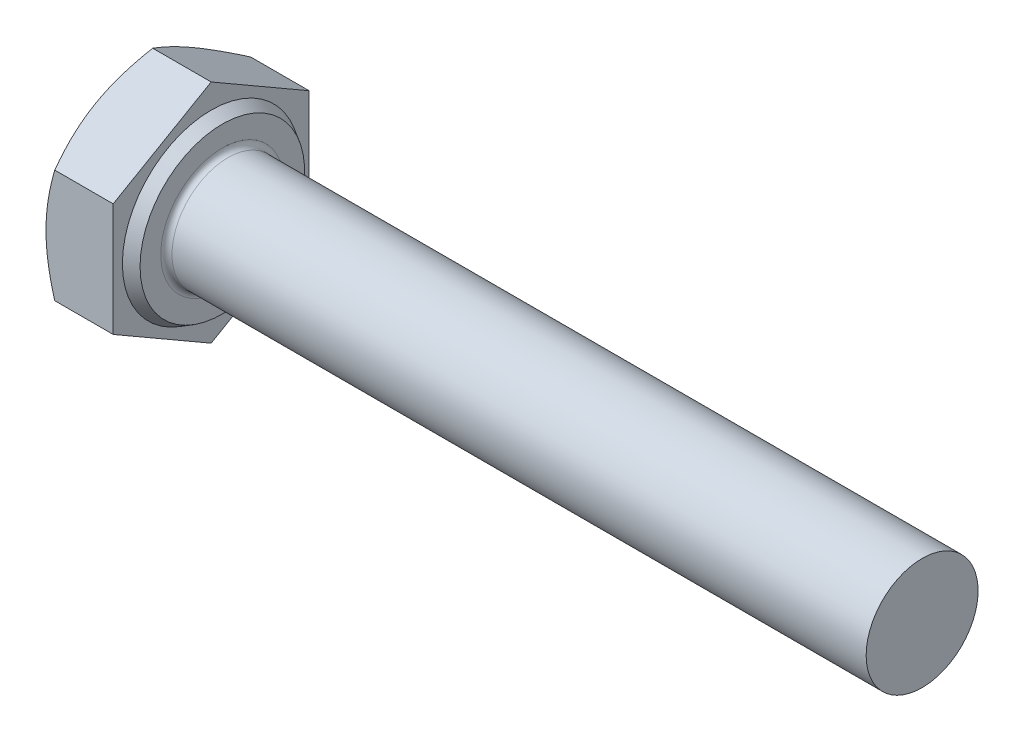
ISO-10303-21;
HEADER;
FILE_DESCRIPTION(('STEP AP214'),'2;1');
FILE_NAME('part.step','',(''),(''),'','','');
FILE_SCHEMA(('AUTOMOTIVE_DESIGN { 1 0 10303 214 1 1 1 1 }'));
ENDSEC;
DATA;
#1=APPLICATION_CONTEXT('core data for automotive mechanical design processes');
#2=APPLICATION_PROTOCOL_DEFINITION('international standard','automotive_design',2000,#1);
#3=PRODUCT_CONTEXT('',#1,'mechanical');
#4=PRODUCT('Part','Part','',(#3));
#5=PRODUCT_RELATED_PRODUCT_CATEGORY('part','',(#4));
#6=PRODUCT_DEFINITION_FORMATION('','',#4);
#7=PRODUCT_DEFINITION_CONTEXT('part definition',#1,'design');
#8=PRODUCT_DEFINITION('design','',#6,#7);
#9=PRODUCT_DEFINITION_SHAPE('','',#8);
#10=(LENGTH_UNIT() NAMED_UNIT(*) SI_UNIT(.MILLI.,.METRE.));
#11=(NAMED_UNIT(*) PLANE_ANGLE_UNIT() SI_UNIT($,.RADIAN.));
#12=(NAMED_UNIT(*) SI_UNIT($,.STERADIAN.) SOLID_ANGLE_UNIT());
#13=UNCERTAINTY_MEASURE_WITH_UNIT(LENGTH_MEASURE(1.E-05),#10,'distance_accuracy_value','');
#14=(GEOMETRIC_REPRESENTATION_CONTEXT(3) GLOBAL_UNCERTAINTY_ASSIGNED_CONTEXT((#13)) GLOBAL_UNIT_ASSIGNED_CONTEXT((#10,
#11,#12)) REPRESENTATION_CONTEXT('',''));
#15=CARTESIAN_POINT('',(0.,0.,0.));
#16=DIRECTION('',(0.,0.,1.));
#17=DIRECTION('',(1.,0.,0.));
#18=AXIS2_PLACEMENT_3D('',#15,#16,#17);
#19=CARTESIAN_POINT('',(2.8,2.02072594216369,-3.5));
#20=DIRECTION('',(0.,-0.866025403784438,0.500000000000001));
#21=DIRECTION('',(0.,-0.500000000000001,-0.866025403784438));
#22=AXIS2_PLACEMENT_3D('',#19,#20,#21);
#23=PLANE('',#22);
#24=DIRECTION('',(0.,0.500000000000001,0.866025403784438));
#25=VECTOR('',#24,1.);
#26=CARTESIAN_POINT('',(2.4,2.02072594216369,-3.5));
#27=LINE('',#26,#25);
#28=CARTESIAN_POINT('',(2.4,2.02072594216369,-3.5));
#29=VERTEX_POINT('',#28);
#30=CARTESIAN_POINT('',(2.4,4.04145188432738,0.));
#31=VERTEX_POINT('',#30);
#32=EDGE_CURVE('E117',#29,#31,#27,.T.);
#33=ORIENTED_EDGE('',*,*,#32,.F.);
#34=DIRECTION('',(-1.,0.,0.));
#35=VECTOR('',#34,1.);
#36=CARTESIAN_POINT('',(2.8,2.02072594216369,-3.5));
#37=LINE('',#36,#35);
#38=CARTESIAN_POINT('',(0.312607391169641,2.02072594216369,-3.5));
#39=VERTEX_POINT('',#38);
#40=EDGE_CURVE('E265',#29,#39,#37,.T.);
#41=ORIENTED_EDGE('',*,*,#40,.T.);
#42=CARTESIAN_POINT('',(0.312674060693371,4.04156735438122,0.0002));
#43=CARTESIAN_POINT('',(0.261385788989984,3.9527667384984,-0.153607178452449));
#44=CARTESIAN_POINT('',(0.214740953816197,3.86319960126198,-0.308742010834424));
#45=CARTESIAN_POINT('',(0.133321875533349,3.68251437287562,-0.621698006576781));
#46=CARTESIAN_POINT('',(0.0985764355845619,3.59139307116725,-0.779524730787495));
#47=CARTESIAN_POINT('',(0.0444900271828364,3.41027974688034,-1.09322221038013));
#48=CARTESIAN_POINT('',(0.0247890862603817,3.32031559103708,-1.24904469916069));
#49=CARTESIAN_POINT('',(0.00127013273725419,3.13996396008052,-1.56142288720537));
#50=CARTESIAN_POINT('',(-0.00256735545443515,3.04957714051106,-1.71797745103423));
#51=CARTESIAN_POINT('',(0.00541530187697707,2.88068384499777,-2.01050921992099));
#52=CARTESIAN_POINT('',(0.0152754340696065,2.80215208834114,-2.14653021245791));
#53=CARTESIAN_POINT('',(0.0465264668994026,2.64560020969753,-2.41768602028899));
#54=CARTESIAN_POINT('',(0.067928043285797,2.56758062920649,-2.55281989768468));
#55=CARTESIAN_POINT('',(0.121430407880576,2.41070596159678,-2.82453479240518));
#56=CARTESIAN_POINT('',(0.153757994445085,2.33187072981463,-2.96108141927834));
#57=CARTESIAN_POINT('',(0.227128933807992,2.17537608630782,-3.2321380929445));
#58=CARTESIAN_POINT('',(0.268155046569865,2.09771466960098,-3.36665161246854));
#59=CARTESIAN_POINT('',(0.312674060693369,2.02061047210985,-3.5002));
#60=B_SPLINE_CURVE_WITH_KNOTS('',3,(#42,#43,#44,#45,#46,#47,#48,#49,#50,#51,#52,#53,#54,#55,#56,
#57,#58,#59),.UNSPECIFIED.,.F.,.F.,(4,2,2,2,2,2,2,2,4),(0.,0.554793832886254,1.11092123814984,
1.65328467083219,2.19498204478403,2.6666513085086,3.13875761298267,3.6213361260051,
4.10296698719188),.UNSPECIFIED.);
#61=CARTESIAN_POINT('',(0.,3.03108891324553,-1.75));
#62=VERTEX_POINT('',#61);
#63=EDGE_CURVE('E173',#62,#39,#60,.T.);
#64=ORIENTED_EDGE('',*,*,#63,.F.);
#65=CARTESIAN_POINT('',(0.312607391169643,4.04145188432738,0.));
#66=VERTEX_POINT('',#65);
#67=EDGE_CURVE('E63',#66,#62,#60,.T.);
#68=ORIENTED_EDGE('',*,*,#67,.F.);
#69=DIRECTION('',(-1.,0.,0.));
#70=VECTOR('',#69,1.);
#71=CARTESIAN_POINT('',(2.8,4.04145188432738,0.));
#72=LINE('',#71,#70);
#73=EDGE_CURVE('E136',#31,#66,#72,.T.);
#74=ORIENTED_EDGE('',*,*,#73,.F.);
#75=EDGE_LOOP('',(#33,#41,#64,#68,#74));
#76=FACE_BOUND('',#75,.T.);
#77=ADVANCED_FACE('F40',(#76),#23,.F.);
#78=CARTESIAN_POINT('',(2.8,4.04145188432738,0.));
#79=DIRECTION('',(0.,-0.866025403784438,-0.500000000000001));
#80=DIRECTION('',(0.,0.500000000000001,-0.866025403784438));
#81=AXIS2_PLACEMENT_3D('',#78,#79,#80);
#82=PLANE('',#81);
#83=DIRECTION('',(0.,-0.500000000000001,0.866025403784438));
#84=VECTOR('',#83,1.);
#85=CARTESIAN_POINT('',(2.4,4.04145188432738,0.));
#86=LINE('',#85,#84);
#87=CARTESIAN_POINT('',(2.4,2.0207259421637,3.5));
#88=VERTEX_POINT('',#87);
#89=EDGE_CURVE('E111',#31,#88,#86,.T.);
#90=ORIENTED_EDGE('',*,*,#89,.F.);
#91=ORIENTED_EDGE('',*,*,#73,.T.);
#92=CARTESIAN_POINT('',(0.312674060693369,2.02061047210985,3.5002));
#93=CARTESIAN_POINT('',(0.261385788989982,2.10941108799267,3.34639282154755));
#94=CARTESIAN_POINT('',(0.214740953816196,2.19897822522909,3.19125798916558));
#95=CARTESIAN_POINT('',(0.133321875533348,2.37966345361545,2.87830199342322));
#96=CARTESIAN_POINT('',(0.0985764355845611,2.47078475532382,2.7204752692125));
#97=CARTESIAN_POINT('',(0.044490027182836,2.65189807961073,2.40677778961987));
#98=CARTESIAN_POINT('',(0.0247890862603815,2.74186223545399,2.25095530083931));
#99=CARTESIAN_POINT('',(0.00127013273725459,2.92221386641056,1.93857711279463));
#100=CARTESIAN_POINT('',(-0.00256735545443442,3.01260068598001,1.78202254896577));
#101=CARTESIAN_POINT('',(0.00541530187697819,3.1814939814933,1.48949078007901));
#102=CARTESIAN_POINT('',(0.0152754340696077,3.26002573814993,1.35346978754209));
#103=CARTESIAN_POINT('',(0.0465264668994042,3.41657761679354,1.08231397971101));
#104=CARTESIAN_POINT('',(0.0679280432857989,3.49459719728458,0.947180102315318));
#105=CARTESIAN_POINT('',(0.121430407880578,3.65147186489429,0.675465207594817));
#106=CARTESIAN_POINT('',(0.153757994445088,3.73030709667644,0.538918580721665));
#107=CARTESIAN_POINT('',(0.227128933807995,3.88680174018324,0.267861907055498));
#108=CARTESIAN_POINT('',(0.268155046569867,3.96446315689009,0.133348387531463));
#109=CARTESIAN_POINT('',(0.312674060693371,4.04156735438122,-0.000200000000000185));
#110=B_SPLINE_CURVE_WITH_KNOTS('',3,(#92,#93,#94,#95,#96,#97,#98,#99,#100,#101,#102,#103,#104,
#105,#106,#107,#108,#109),.UNSPECIFIED.,.F.,.F.,(4,2,2,2,2,2,2,2,4),(0.,0.554793832886253,
1.11092123814984,1.65328467083219,2.19498204478403,2.6666513085086,3.13875761298267,
3.6213361260051,4.10296698719187),.UNSPECIFIED.);
#111=CARTESIAN_POINT('',(0.,3.03108891324553,1.75));
#112=VERTEX_POINT('',#111);
#113=EDGE_CURVE('E221',#112,#66,#110,.T.);
#114=ORIENTED_EDGE('',*,*,#113,.F.);
#115=CARTESIAN_POINT('',(0.312607391169641,2.02072594216369,3.5));
#116=VERTEX_POINT('',#115);
#117=EDGE_CURVE('E135',#116,#112,#110,.T.);
#118=ORIENTED_EDGE('',*,*,#117,.F.);
#119=DIRECTION('',(-1.,0.,0.));
#120=VECTOR('',#119,1.);
#121=CARTESIAN_POINT('',(2.8,2.02072594216369,3.5));
#122=LINE('',#121,#120);
#123=EDGE_CURVE('E126',#88,#116,#122,.T.);
#124=ORIENTED_EDGE('',*,*,#123,.F.);
#125=EDGE_LOOP('',(#90,#91,#114,#118,#124));
#126=FACE_BOUND('',#125,.T.);
#127=ADVANCED_FACE('F133',(#126),#82,.F.);
#128=CARTESIAN_POINT('',(2.8,2.02072594216369,3.5));
#129=DIRECTION('',(0.,0.,-1.));
#130=DIRECTION('',(0.,1.,0.));
#131=AXIS2_PLACEMENT_3D('',#128,#129,#130);
#132=PLANE('',#131);
#133=DIRECTION('',(0.,-1.,0.));
#134=VECTOR('',#133,1.);
#135=CARTESIAN_POINT('',(2.4,2.02072594216369,3.5));
#136=LINE('',#135,#134);
#137=CARTESIAN_POINT('',(2.4,-2.02072594216369,3.50000000000001));
#138=VERTEX_POINT('',#137);
#139=EDGE_CURVE('E114',#88,#138,#136,.T.);
#140=ORIENTED_EDGE('',*,*,#139,.F.);
#141=ORIENTED_EDGE('',*,*,#123,.T.);
#142=CARTESIAN_POINT('',(1.74876972157984,-5.51155991321369,3.5));
#143=CARTESIAN_POINT('',(1.67392335905171,-5.3579514616812,3.5));
#144=CARTESIAN_POINT('',(1.59977092482585,-5.20399921009228,3.5));
#145=CARTESIAN_POINT('',(1.45324265085096,-4.89522454872941,3.5));
#146=CARTESIAN_POINT('',(1.38086707569563,-4.74040201352887,3.5));
#147=CARTESIAN_POINT('',(1.23793493282186,-4.42894615034128,3.5));
#148=CARTESIAN_POINT('',(1.16738971082227,-4.27230759822602,3.5));
#149=CARTESIAN_POINT('',(1.02907715104181,-3.95781335182266,3.5));
#150=CARTESIAN_POINT('',(0.961309687300874,-3.79995771311102,3.5));
#151=CARTESIAN_POINT('',(0.827049257300865,-3.47741113153965,3.5));
#152=CARTESIAN_POINT('',(0.760677039603637,-3.31266966015407,3.5));
#153=CARTESIAN_POINT('',(0.632756390660451,-2.98129055183974,3.5));
#154=CARTESIAN_POINT('',(0.571208488744782,-2.81465270912935,3.5));
#155=CARTESIAN_POINT('',(0.454490935223125,-2.47950135030688,3.5));
#156=CARTESIAN_POINT('',(0.399309072211479,-2.31099212862995,3.5));
#157=CARTESIAN_POINT('',(0.297038623006436,-1.97155788003879,3.5));
#158=CARTESIAN_POINT('',(0.249947575310255,-1.80063360505407,3.5));
#159=CARTESIAN_POINT('',(0.166312731854841,-1.45721769418154,3.5));
#160=CARTESIAN_POINT('',(0.129709932807452,-1.28474069128699,3.5));
#161=CARTESIAN_POINT('',(0.0690664438522148,-0.937557025087311,3.5));
#162=CARTESIAN_POINT('',(0.0450243878605912,-0.762850606367495,3.5));
#163=CARTESIAN_POINT('',(0.0117307991317233,-0.414396256841876,3.5));
#164=CARTESIAN_POINT('',(0.00228260582206833,-0.240667592567808,3.5));
#165=CARTESIAN_POINT('',(-0.00154556659445001,0.106974360360037,3.5));
#166=CARTESIAN_POINT('',(0.00407467645780433,0.280887651698045,3.5));
#167=CARTESIAN_POINT('',(0.0258160054827252,0.57367772999446,3.5));
#168=CARTESIAN_POINT('',(0.0381294862842096,0.692856453275201,3.5));
#169=CARTESIAN_POINT('',(0.0691104272904701,0.930390570440092,3.5));
#170=CARTESIAN_POINT('',(0.0877786801448133,1.04874585973469,3.5));
#171=CARTESIAN_POINT('',(0.152339395306958,1.40238821087657,3.5));
#172=CARTESIAN_POINT('',(0.20677796414363,1.63613518036601,3.5));
#173=CARTESIAN_POINT('',(0.301818253018759,1.98584040729012,3.5));
#174=CARTESIAN_POINT('',(0.336200477312343,2.10359260573207,3.5));
#175=CARTESIAN_POINT('',(0.408694225276309,2.33795452904032,3.5));
#176=CARTESIAN_POINT('',(0.44680577771455,2.45456424508594,3.5));
#177=CARTESIAN_POINT('',(0.526133500138819,2.6866764850323,3.5));
#178=CARTESIAN_POINT('',(0.567348796819712,2.80217931014603,3.5));
#179=CARTESIAN_POINT('',(0.65238331808422,3.03221622177693,3.5));
#180=CARTESIAN_POINT('',(0.696202482848098,3.14675033047981,3.5));
#181=CARTESIAN_POINT('',(0.817586419233473,3.45518824474218,3.5));
#182=CARTESIAN_POINT('',(0.897216282952767,3.64827858337668,3.5));
#183=CARTESIAN_POINT('',(1.061161216531,4.03246733734999,3.5));
#184=CARTESIAN_POINT('',(1.1454768083918,4.22356552793098,3.5));
#185=CARTESIAN_POINT('',(1.31768022375102,4.60422080078618,3.5));
#186=CARTESIAN_POINT('',(1.4055692882719,4.7937773197528,3.5));
#187=CARTESIAN_POINT('',(1.58407294204471,5.17160542987795,3.5));
#188=CARTESIAN_POINT('',(1.67468761529442,5.35987698121653,3.5));
#189=CARTESIAN_POINT('',(1.85818750847656,5.73567568183913,3.5));
#190=CARTESIAN_POINT('',(1.95107608160113,5.92320119040396,3.5));
#191=CARTESIAN_POINT('',(2.13854805032034,6.29740401332884,3.5));
#192=CARTESIAN_POINT('',(2.23313146399147,6.48408131861562,3.5));
#193=CARTESIAN_POINT('',(2.51886264902323,7.04299370579129,3.5));
#194=CARTESIAN_POINT('',(2.71203324129307,7.41419418594085,3.5));
#195=CARTESIAN_POINT('',(3.08131090771228,8.11545297373332,3.5));
#196=CARTESIAN_POINT('',(3.25705679900322,8.44570240603794,3.5));
#197=CARTESIAN_POINT('',(3.61066708019842,9.10509095269336,3.5));
#198=CARTESIAN_POINT('',(3.7885316009934,9.43422999681452,3.5));
#199=CARTESIAN_POINT('',(4.14522643131463,10.0905480448887,3.5));
#200=CARTESIAN_POINT('',(4.32405147197679,10.4177299168719,3.5));
#201=CARTESIAN_POINT('',(4.68290305302711,11.0714005801046,3.5));
#202=CARTESIAN_POINT('',(4.86292949694074,11.397889424295,3.5));
#203=CARTESIAN_POINT('',(5.04339321716841,11.7241348717818,3.5));
#204=B_SPLINE_CURVE_WITH_KNOTS('',3,(#142,#143,#144,#145,#146,#147,#148,#149,#150,#151,#152,
#153,#154,#155,#156,#157,#158,#159,#160,#161,#162,#163,#164,#165,#166,#167,#168,#169,#170,#171,
#172,#173,#174,#175,#176,#177,#178,#179,#180,#181,#182,#183,#184,#185,#186,#187,#188,#189,#190,
#191,#192,#193,#194,#195,#196,#197,#198,#199,#200,#201,#202,#203),.UNSPECIFIED.,.F.,.F.,(4,2,2,
2,2,2,2,2,2,2,2,2,2,2,2,2,2,2,2,2,2,2,2,2,2,2,2,2,2,2,4),(0.,0.512624455055138,1.02532478807013,
1.54067716579031,2.05600614845993,2.58877526662742,3.12160275933496,3.6533905567045,
4.18501627844403,4.71358974605644,5.24210571499795,5.76343550148056,6.28477297414901,
6.64403977227186,7.00335139923843,7.72232402023061,8.0902978978206,8.45827461416728,
8.82614817645966,9.1940132907056,9.82051720102626,10.4470910459092,11.0738843824793,
11.7006970553932,12.3284975462801,12.9563047370264,14.2116350789245,15.333929259245,
16.4562931392235,17.5748776783279,18.6933734490332),.UNSPECIFIED.);
#205=CARTESIAN_POINT('',(0.,0.,3.5));
#206=VERTEX_POINT('',#205);
#207=EDGE_CURVE('E226',#206,#116,#204,.T.);
#208=ORIENTED_EDGE('',*,*,#207,.F.);
#209=CARTESIAN_POINT('',(0.312607391169641,-2.02072594216369,3.5));
#210=VERTEX_POINT('',#209);
#211=EDGE_CURVE('E232',#210,#206,#204,.T.);
#212=ORIENTED_EDGE('',*,*,#211,.F.);
#213=DIRECTION('',(-1.,0.,0.));
#214=VECTOR('',#213,1.);
#215=CARTESIAN_POINT('',(2.8,-2.02072594216369,3.5));
#216=LINE('',#215,#214);
#217=EDGE_CURVE('E129',#138,#210,#216,.T.);
#218=ORIENTED_EDGE('',*,*,#217,.F.);
#219=EDGE_LOOP('',(#140,#141,#208,#212,#218));
#220=FACE_BOUND('',#219,.T.);
#221=ADVANCED_FACE('F124',(#220),#132,.F.);
#222=CARTESIAN_POINT('',(2.8,-4.04145188432739,0.));
#223=DIRECTION('',(0.,0.866025403784438,-0.500000000000001));
#224=DIRECTION('',(0.,0.500000000000001,0.866025403784438));
#225=AXIS2_PLACEMENT_3D('',#222,#223,#224);
#226=PLANE('',#225);
#227=DIRECTION('',(0.,-0.500000000000001,-0.866025403784438));
#228=VECTOR('',#227,1.);
#229=CARTESIAN_POINT('',(2.4,-4.04145188432739,0.));
#230=LINE('',#229,#228);
#231=CARTESIAN_POINT('',(2.4,-4.04145188432738,0.));
#232=VERTEX_POINT('',#231);
#233=EDGE_CURVE('E130',#138,#232,#230,.T.);
#234=ORIENTED_EDGE('',*,*,#233,.F.);
#235=ORIENTED_EDGE('',*,*,#217,.T.);
#236=CARTESIAN_POINT('',(0.312674060693373,-4.04156735438123,-0.000199999999999297));
#237=CARTESIAN_POINT('',(0.261385788989986,-3.95276673849841,0.15360717845245));
#238=CARTESIAN_POINT('',(0.214740953816199,-3.86319960126199,0.308742010834425));
#239=CARTESIAN_POINT('',(0.133321875533351,-3.68251437287563,0.621698006576782));
#240=CARTESIAN_POINT('',(0.0985764355845637,-3.59139307116725,0.779524730787497));
#241=CARTESIAN_POINT('',(0.0444900271828383,-3.41027974688034,1.09322221038013));
#242=CARTESIAN_POINT('',(0.0247890862603835,-3.32031559103708,1.24904469916069));
#243=CARTESIAN_POINT('',(0.00127013273725607,-3.13996396008052,1.56142288720538));
#244=CARTESIAN_POINT('',(-0.00256735545443317,-3.04957714051106,1.71797745103423));
#245=CARTESIAN_POINT('',(0.00541530187697909,-2.88068384499778,2.01050921992099));
#246=CARTESIAN_POINT('',(0.0152754340696084,-2.80215208834115,2.14653021245791));
#247=CARTESIAN_POINT('',(0.0465264668994043,-2.64560020969754,2.417686020289));
#248=CARTESIAN_POINT('',(0.0679280432857985,-2.5675806292065,2.55281989768468));
#249=CARTESIAN_POINT('',(0.121430407880577,-2.41070596159678,2.82453479240518));
#250=CARTESIAN_POINT('',(0.153757994445086,-2.33187072981464,2.96108141927834));
#251=CARTESIAN_POINT('',(0.227128933807993,-2.17537608630783,3.2321380929445));
#252=CARTESIAN_POINT('',(0.268155046569865,-2.09771466960098,3.36665161246854));
#253=CARTESIAN_POINT('',(0.312674060693369,-2.02061047210985,3.5002));
#254=B_SPLINE_CURVE_WITH_KNOTS('',3,(#236,#237,#238,#239,#240,#241,#242,#243,#244,#245,#246,
#247,#248,#249,#250,#251,#252,#253),.UNSPECIFIED.,.F.,.F.,(4,2,2,2,2,2,2,2,4),(0.,
0.554793832886254,1.11092123814984,1.65328467083219,2.19498204478403,2.6666513085086,
3.13875761298267,3.6213361260051,4.10296698719187),.UNSPECIFIED.);
#255=CARTESIAN_POINT('',(0.,-3.03108891324553,1.75));
#256=VERTEX_POINT('',#255);
#257=EDGE_CURVE('E233',#256,#210,#254,.T.);
#258=ORIENTED_EDGE('',*,*,#257,.F.);
#259=CARTESIAN_POINT('',(0.312607391169645,-4.04145188432739,0.));
#260=VERTEX_POINT('',#259);
#261=EDGE_CURVE('E189',#260,#256,#254,.T.);
#262=ORIENTED_EDGE('',*,*,#261,.F.);
#263=DIRECTION('',(-1.,0.,0.));
#264=VECTOR('',#263,1.);
#265=CARTESIAN_POINT('',(2.8,-4.04145188432739,0.));
#266=LINE('',#265,#264);
#267=EDGE_CURVE('E140',#232,#260,#266,.T.);
#268=ORIENTED_EDGE('',*,*,#267,.F.);
#269=EDGE_LOOP('',(#234,#235,#258,#262,#268));
#270=FACE_BOUND('',#269,.T.);
#271=ADVANCED_FACE('F238',(#270),#226,.F.);
#272=CARTESIAN_POINT('',(2.8,-2.0207259421637,-3.5));
#273=DIRECTION('',(0.,0.866025403784439,0.5));
#274=DIRECTION('',(0.,-0.5,0.866025403784439));
#275=AXIS2_PLACEMENT_3D('',#272,#273,#274);
#276=PLANE('',#275);
#277=DIRECTION('',(0.,0.5,-0.866025403784439));
#278=VECTOR('',#277,1.);
#279=CARTESIAN_POINT('',(2.4,-2.0207259421637,-3.5));
#280=LINE('',#279,#278);
#281=CARTESIAN_POINT('',(2.4,-2.0207259421637,-3.5));
#282=VERTEX_POINT('',#281);
#283=EDGE_CURVE('E55',#232,#282,#280,.T.);
#284=ORIENTED_EDGE('',*,*,#283,.F.);
#285=ORIENTED_EDGE('',*,*,#267,.T.);
#286=CARTESIAN_POINT('',(0.312674060693372,-2.02061047210986,-3.5002));
#287=CARTESIAN_POINT('',(0.261385788989984,-2.10941108799268,-3.34639282154755));
#288=CARTESIAN_POINT('',(0.214740953816198,-2.1989782252291,-3.19125798916558));
#289=CARTESIAN_POINT('',(0.133321875533351,-2.37966345361545,-2.87830199342322));
#290=CARTESIAN_POINT('',(0.0985764355845634,-2.47078475532383,-2.72047526921251));
#291=CARTESIAN_POINT('',(0.0444900271828386,-2.65189807961074,-2.40677778961987));
#292=CARTESIAN_POINT('',(0.0247890862603844,-2.741862235454,-2.25095530083931));
#293=CARTESIAN_POINT('',(0.00127013273725749,-2.92221386641056,-1.93857711279463));
#294=CARTESIAN_POINT('',(-0.00256735545443165,-3.01260068598002,-1.78202254896577));
#295=CARTESIAN_POINT('',(0.00541530187698094,-3.1814939814933,-1.48949078007901));
#296=CARTESIAN_POINT('',(0.0152754340696105,-3.26002573814993,-1.35346978754209));
#297=CARTESIAN_POINT('',(0.0465264668994069,-3.41657761679354,-1.08231397971101));
#298=CARTESIAN_POINT('',(0.0679280432858014,-3.49459719728458,-0.947180102315317));
#299=CARTESIAN_POINT('',(0.12143040788058,-3.65147186489429,-0.675465207594816));
#300=CARTESIAN_POINT('',(0.15375799444509,-3.73030709667644,-0.538918580721664));
#301=CARTESIAN_POINT('',(0.227128933807997,-3.88680174018325,-0.267861907055498));
#302=CARTESIAN_POINT('',(0.268155046569869,-3.96446315689009,-0.133348387531463));
#303=CARTESIAN_POINT('',(0.312674060693373,-4.04156735438123,0.00020000000000075));
#304=B_SPLINE_CURVE_WITH_KNOTS('',3,(#286,#287,#288,#289,#290,#291,#292,#293,#294,#295,#296,
#297,#298,#299,#300,#301,#302,#303),.UNSPECIFIED.,.F.,.F.,(4,2,2,2,2,2,2,2,4),(0.,
0.554793832886254,1.11092123814984,1.65328467083219,2.19498204478403,2.6666513085086,
3.13875761298267,3.6213361260051,4.10296698719187),.UNSPECIFIED.);
#305=CARTESIAN_POINT('',(0.,-3.03108891324554,-1.75));
#306=VERTEX_POINT('',#305);
#307=EDGE_CURVE('E284',#306,#260,#304,.T.);
#308=ORIENTED_EDGE('',*,*,#307,.F.);
#309=CARTESIAN_POINT('',(0.312607391169536,-2.02072594216386,-3.5));
#310=VERTEX_POINT('',#309);
#311=EDGE_CURVE('E182',#310,#306,#304,.T.);
#312=ORIENTED_EDGE('',*,*,#311,.F.);
#313=DIRECTION('',(-1.,0.,0.));
#314=VECTOR('',#313,1.);
#315=CARTESIAN_POINT('',(2.8,-2.0207259421637,-3.5));
#316=LINE('',#315,#314);
#317=EDGE_CURVE('E266',#282,#310,#316,.T.);
#318=ORIENTED_EDGE('',*,*,#317,.F.);
#319=EDGE_LOOP('',(#284,#285,#308,#312,#318));
#320=FACE_BOUND('',#319,.T.);
#321=ADVANCED_FACE('F241',(#320),#276,.F.);
#322=CARTESIAN_POINT('',(2.8,2.02072594216369,-3.5));
#323=DIRECTION('',(0.,0.,1.));
#324=DIRECTION('',(1.,0.,0.));
#325=AXIS2_PLACEMENT_3D('',#322,#323,#324);
#326=PLANE('',#325);
#327=DIRECTION('',(0.,1.,0.));
#328=VECTOR('',#327,1.);
#329=CARTESIAN_POINT('',(2.4,2.02072594216369,-3.5));
#330=LINE('',#329,#328);
#331=EDGE_CURVE('E148',#282,#29,#330,.T.);
#332=ORIENTED_EDGE('',*,*,#331,.F.);
#333=ORIENTED_EDGE('',*,*,#317,.T.);
#334=CARTESIAN_POINT('',(1.74876972157984,-5.51155991321369,-3.5));
#335=CARTESIAN_POINT('',(1.67392335905172,-5.35795146168121,-3.5));
#336=CARTESIAN_POINT('',(1.59977092482585,-5.20399921009228,-3.5));
#337=CARTESIAN_POINT('',(1.45324265085097,-4.89522454872941,-3.5));
#338=CARTESIAN_POINT('',(1.38086707569563,-4.74040201352888,-3.5));
#339=CARTESIAN_POINT('',(1.23793493282186,-4.42894615034128,-3.5));
#340=CARTESIAN_POINT('',(1.16738971082228,-4.27230759822602,-3.5));
#341=CARTESIAN_POINT('',(1.02907715104182,-3.95781335182267,-3.5));
#342=CARTESIAN_POINT('',(0.961309687300878,-3.79995771311102,-3.5));
#343=CARTESIAN_POINT('',(0.827049257300869,-3.47741113153965,-3.5));
#344=CARTESIAN_POINT('',(0.760677039603641,-3.31266966015407,-3.5));
#345=CARTESIAN_POINT('',(0.632756390660455,-2.98129055183974,-3.5));
#346=CARTESIAN_POINT('',(0.571208488744786,-2.81465270912935,-3.5));
#347=CARTESIAN_POINT('',(0.454490935223128,-2.47950135030689,-3.5));
#348=CARTESIAN_POINT('',(0.399309072211483,-2.31099212862996,-3.5));
#349=CARTESIAN_POINT('',(0.297038623006439,-1.9715578800388,-3.5));
#350=CARTESIAN_POINT('',(0.249947575310258,-1.80063360505407,-3.5));
#351=CARTESIAN_POINT('',(0.166312731854844,-1.45721769418154,-3.5));
#352=CARTESIAN_POINT('',(0.129709932807455,-1.284740691287,-3.5));
#353=CARTESIAN_POINT('',(0.0690664438522172,-0.937557025087316,-3.5));
#354=CARTESIAN_POINT('',(0.0450243878605935,-0.7628506063675,-3.5));
#355=CARTESIAN_POINT('',(0.0117307991317253,-0.414396256841881,-3.5));
#356=CARTESIAN_POINT('',(0.0022826058220703,-0.240667592567812,-3.5));
#357=CARTESIAN_POINT('',(-0.00154556659444845,0.106974360360033,-3.5));
#358=CARTESIAN_POINT('',(0.00407467645780556,0.280887651698041,-3.5));
#359=CARTESIAN_POINT('',(0.0258160054827262,0.573677729994458,-3.5));
#360=CARTESIAN_POINT('',(0.0381294862842106,0.692856453275198,-3.5));
#361=CARTESIAN_POINT('',(0.0691104272904712,0.930390570440089,-3.5));
#362=CARTESIAN_POINT('',(0.0877786801448144,1.04874585973469,-3.5));
#363=CARTESIAN_POINT('',(0.152339395306959,1.40238821087657,-3.5));
#364=CARTESIAN_POINT('',(0.20677796414363,1.63613518036601,-3.5));
#365=CARTESIAN_POINT('',(0.301818253018759,1.98584040729012,-3.5));
#366=CARTESIAN_POINT('',(0.336200477312343,2.10359260573206,-3.5));
#367=CARTESIAN_POINT('',(0.408694225276309,2.33795452904032,-3.5));
#368=CARTESIAN_POINT('',(0.446805777714549,2.45456424508594,-3.5));
#369=CARTESIAN_POINT('',(0.526133500138819,2.6866764850323,-3.5));
#370=CARTESIAN_POINT('',(0.567348796819712,2.80217931014603,-3.5));
#371=CARTESIAN_POINT('',(0.652383318084219,3.03221622177692,-3.5));
#372=CARTESIAN_POINT('',(0.696202482848097,3.14675033047981,-3.5));
#373=CARTESIAN_POINT('',(0.817586419233472,3.45518824474218,-3.5));
#374=CARTESIAN_POINT('',(0.897216282952766,3.64827858337667,-3.5));
#375=CARTESIAN_POINT('',(1.061161216531,4.03246733734998,-3.5));
#376=CARTESIAN_POINT('',(1.1454768083918,4.22356552793097,-3.5));
#377=CARTESIAN_POINT('',(1.31768022375102,4.60422080078617,-3.5));
#378=CARTESIAN_POINT('',(1.4055692882719,4.7937773197528,-3.5));
#379=CARTESIAN_POINT('',(1.5840729420447,5.17160542987795,-3.5));
#380=CARTESIAN_POINT('',(1.67468761529442,5.35987698121652,-3.5));
#381=CARTESIAN_POINT('',(1.85818750847656,5.73567568183912,-3.5));
#382=CARTESIAN_POINT('',(1.95107608160113,5.92320119040396,-3.5));
#383=CARTESIAN_POINT('',(2.13854805032033,6.29740401332883,-3.5));
#384=CARTESIAN_POINT('',(2.23313146399146,6.48408131861562,-3.5));
#385=CARTESIAN_POINT('',(2.51886264902323,7.04299370579128,-3.5));
#386=CARTESIAN_POINT('',(2.71203324129306,7.41419418594084,-3.5));
#387=CARTESIAN_POINT('',(3.08131090771227,8.11545297373331,-3.5));
#388=CARTESIAN_POINT('',(3.25705679900321,8.44570240603793,-3.5));
#389=CARTESIAN_POINT('',(3.61066708019842,9.10509095269335,-3.5));
#390=CARTESIAN_POINT('',(3.7885316009934,9.43422999681451,-3.5));
#391=CARTESIAN_POINT('',(4.14522643131462,10.0905480448887,-3.5));
#392=CARTESIAN_POINT('',(4.32405147197678,10.4177299168719,-3.5));
#393=CARTESIAN_POINT('',(4.68290305302711,11.0714005801046,-3.5));
#394=CARTESIAN_POINT('',(4.86292949694073,11.397889424295,-3.5));
#395=CARTESIAN_POINT('',(5.04339321716841,11.7241348717818,-3.5));
#396=B_SPLINE_CURVE_WITH_KNOTS('',3,(#334,#335,#336,#337,#338,#339,#340,#341,#342,#343,#344,
#345,#346,#347,#348,#349,#350,#351,#352,#353,#354,#355,#356,#357,#358,#359,#360,#361,#362,#363,
#364,#365,#366,#367,#368,#369,#370,#371,#372,#373,#374,#375,#376,#377,#378,#379,#380,#381,#382,
#383,#384,#385,#386,#387,#388,#389,#390,#391,#392,#393,#394,#395),.UNSPECIFIED.,.F.,.F.,(4,2,2,
2,2,2,2,2,2,2,2,2,2,2,2,2,2,2,2,2,2,2,2,2,2,2,2,2,2,2,4),(0.,0.512624455055139,1.02532478807014,
1.54067716579031,2.05600614845994,2.58877526662743,3.12160275933497,3.6533905567045,
4.18501627844403,4.71358974605644,5.24210571499796,5.76343550148056,6.28477297414902,
6.64403977227186,7.00335139923844,7.72232402023061,8.09029789782061,8.45827461416729,
8.82614817645967,9.19401329070561,9.82051720102627,10.4470910459092,11.0738843824793,
11.7006970553932,12.3284975462801,12.9563047370264,14.2116350789245,15.333929259245,
16.4562931392235,17.5748776783279,18.6933734490332),.UNSPECIFIED.);
#397=CARTESIAN_POINT('',(0.,0.,-3.5));
#398=VERTEX_POINT('',#397);
#399=EDGE_CURVE('E210',#398,#310,#396,.F.);
#400=ORIENTED_EDGE('',*,*,#399,.F.);
#401=EDGE_CURVE('E292',#39,#398,#396,.F.);
#402=ORIENTED_EDGE('',*,*,#401,.F.);
#403=ORIENTED_EDGE('',*,*,#40,.F.);
#404=EDGE_LOOP('',(#332,#333,#400,#402,#403));
#405=FACE_BOUND('',#404,.T.);
#406=ADVANCED_FACE('F245',(#405),#326,.F.);
#407=CARTESIAN_POINT('',(0.,0.,0.));
#408=DIRECTION('',(1.,0.,0.));
#409=DIRECTION('',(0.,0.,-1.));
#410=AXIS2_PLACEMENT_3D('',#407,#408,#409);
#411=CONICAL_SURFACE('',#410,3.5,1.0471975511966);
#412=ORIENTED_EDGE('',*,*,#311,.T.);
#413=CARTESIAN_POINT('',(0.,0.,0.));
#414=DIRECTION('',(1.,0.,0.));
#415=DIRECTION('',(0.,0.,-1.));
#416=AXIS2_PLACEMENT_3D('',#413,#414,#415);
#417=CIRCLE('',#416,3.5);
#418=EDGE_CURVE('E138',#306,#398,#417,.T.);
#419=ORIENTED_EDGE('',*,*,#418,.T.);
#420=ORIENTED_EDGE('',*,*,#399,.T.);
#421=EDGE_LOOP('',(#412,#419,#420));
#422=FACE_BOUND('',#421,.T.);
#423=ADVANCED_FACE('F204',(#422),#411,.T.);
#424=ORIENTED_EDGE('',*,*,#261,.T.);
#425=EDGE_CURVE('E146',#256,#306,#417,.T.);
#426=ORIENTED_EDGE('',*,*,#425,.T.);
#427=ORIENTED_EDGE('',*,*,#307,.T.);
#428=EDGE_LOOP('',(#424,#426,#427));
#429=FACE_BOUND('',#428,.T.);
#430=ADVANCED_FACE('F202',(#429),#411,.T.);
#431=ORIENTED_EDGE('',*,*,#211,.T.);
#432=EDGE_CURVE('E271',#206,#256,#417,.T.);
#433=ORIENTED_EDGE('',*,*,#432,.T.);
#434=ORIENTED_EDGE('',*,*,#257,.T.);
#435=EDGE_LOOP('',(#431,#433,#434));
#436=FACE_BOUND('',#435,.T.);
#437=ADVANCED_FACE('F196',(#436),#411,.T.);
#438=ORIENTED_EDGE('',*,*,#207,.T.);
#439=ORIENTED_EDGE('',*,*,#117,.T.);
#440=CARTESIAN_POINT('',(0.,0.,0.));
#441=DIRECTION('',(-1.,0.,0.));
#442=DIRECTION('',(0.,0.,1.));
#443=AXIS2_PLACEMENT_3D('',#440,#441,#442);
#444=CIRCLE('',#443,3.5);
#445=EDGE_CURVE('E276',#206,#112,#444,.T.);
#446=ORIENTED_EDGE('',*,*,#445,.F.);
#447=EDGE_LOOP('',(#438,#439,#446));
#448=FACE_BOUND('',#447,.T.);
#449=ADVANCED_FACE('F201',(#448),#411,.T.);
#450=ORIENTED_EDGE('',*,*,#113,.T.);
#451=ORIENTED_EDGE('',*,*,#67,.T.);
#452=EDGE_CURVE('E279',#62,#112,#417,.T.);
#453=ORIENTED_EDGE('',*,*,#452,.T.);
#454=EDGE_LOOP('',(#450,#451,#453));
#455=FACE_BOUND('',#454,.T.);
#456=ADVANCED_FACE('F395',(#455),#411,.T.);
#457=ORIENTED_EDGE('',*,*,#63,.T.);
#458=ORIENTED_EDGE('',*,*,#401,.T.);
#459=EDGE_CURVE('E147',#398,#62,#417,.T.);
#460=ORIENTED_EDGE('',*,*,#459,.T.);
#461=EDGE_LOOP('',(#457,#458,#460));
#462=FACE_BOUND('',#461,.T.);
#463=ADVANCED_FACE('F253',(#462),#411,.T.);
#464=CARTESIAN_POINT('',(0.,4.04145188432738,0.));
#465=DIRECTION('',(1.,0.,0.));
#466=DIRECTION('',(0.,0.,-1.));
#467=AXIS2_PLACEMENT_3D('',#464,#465,#466);
#468=PLANE('',#467);
#469=ORIENTED_EDGE('',*,*,#459,.F.);
#470=ORIENTED_EDGE('',*,*,#418,.F.);
#471=ORIENTED_EDGE('',*,*,#425,.F.);
#472=ORIENTED_EDGE('',*,*,#432,.F.);
#473=ORIENTED_EDGE('',*,*,#445,.T.);
#474=ORIENTED_EDGE('',*,*,#452,.F.);
#475=EDGE_LOOP('',(#469,#470,#471,#472,#473,#474));
#476=FACE_BOUND('',#475,.T.);
#477=ADVANCED_FACE('F251',(#476),#468,.F.);
#478=CARTESIAN_POINT('',(2.4,3.17094010767585,0.));
#479=DIRECTION('',(1.,0.,0.));
#480=DIRECTION('',(0.,0.,-1.));
#481=AXIS2_PLACEMENT_3D('',#478,#479,#480);
#482=PLANE('',#481);
#483=CARTESIAN_POINT('',(2.4,0.,0.));
#484=DIRECTION('',(-1.,0.,0.));
#485=DIRECTION('',(0.,0.,1.));
#486=AXIS2_PLACEMENT_3D('',#483,#484,#485);
#487=CIRCLE('',#486,3.17094010767585);
#488=CARTESIAN_POINT('',(2.4,0.,3.17094010767585));
#489=VERTEX_POINT('',#488);
#490=EDGE_CURVE('E302',#489,#489,#487,.T.);
#491=ORIENTED_EDGE('',*,*,#490,.T.);
#492=EDGE_LOOP('',(#491));
#493=FACE_BOUND('',#492,.T.);
#494=ORIENTED_EDGE('',*,*,#32,.T.);
#495=ORIENTED_EDGE('',*,*,#89,.T.);
#496=ORIENTED_EDGE('',*,*,#139,.T.);
#497=ORIENTED_EDGE('',*,*,#233,.T.);
#498=ORIENTED_EDGE('',*,*,#283,.T.);
#499=ORIENTED_EDGE('',*,*,#331,.T.);
#500=EDGE_LOOP('',(#494,#495,#496,#497,#498,#499));
#501=FACE_BOUND('',#500,.T.);
#502=ADVANCED_FACE('F113',(#493,#501),#482,.T.);
#503=CARTESIAN_POINT('',(2.4,0.,0.));
#504=DIRECTION('',(-1.,0.,0.));
#505=DIRECTION('',(0.,0.,1.));
#506=AXIS2_PLACEMENT_3D('',#503,#504,#505);
#507=CONICAL_SURFACE('',#506,3.17094010767585,0.523598775598296);
#508=CARTESIAN_POINT('',(2.8,0.,0.));
#509=DIRECTION('',(-1.,0.,0.));
#510=DIRECTION('',(0.,0.,1.));
#511=AXIS2_PLACEMENT_3D('',#508,#509,#510);
#512=CIRCLE('',#511,2.94);
#513=CARTESIAN_POINT('',(2.8,0.,2.94));
#514=VERTEX_POINT('',#513);
#515=EDGE_CURVE('E305',#514,#514,#512,.T.);
#516=ORIENTED_EDGE('',*,*,#515,.T.);
#517=EDGE_LOOP('',(#516));
#518=FACE_BOUND('',#517,.T.);
#519=ORIENTED_EDGE('',*,*,#490,.F.);
#520=EDGE_LOOP('',(#519));
#521=FACE_BOUND('',#520,.T.);
#522=ADVANCED_FACE('F260',(#518,#521),#507,.T.);
#523=CARTESIAN_POINT('',(27.8,0.,0.));
#524=DIRECTION('',(-1.,0.,0.));
#525=DIRECTION('',(0.,0.,1.));
#526=AXIS2_PLACEMENT_3D('',#523,#524,#525);
#527=PLANE('',#526);
#528=CARTESIAN_POINT('',(27.8,0.,0.));
#529=DIRECTION('',(-1.,0.,0.));
#530=DIRECTION('',(0.,0.,1.));
#531=AXIS2_PLACEMENT_3D('',#528,#529,#530);
#532=CIRCLE('',#531,2.);
#533=CARTESIAN_POINT('',(27.8,0.,2.));
#534=VERTEX_POINT('',#533);
#535=EDGE_CURVE('E234',#534,#534,#532,.T.);
#536=ORIENTED_EDGE('',*,*,#535,.F.);
#537=EDGE_LOOP('',(#536));
#538=FACE_BOUND('',#537,.T.);
#539=ADVANCED_FACE('F206',(#538),#527,.F.);
#540=CARTESIAN_POINT('',(0.,0.,0.));
#541=DIRECTION('',(-1.,0.,0.));
#542=DIRECTION('',(0.,0.,1.));
#543=AXIS2_PLACEMENT_3D('',#540,#541,#542);
#544=CYLINDRICAL_SURFACE('',#543,2.);
#545=CARTESIAN_POINT('',(3.,0.,0.));
#546=DIRECTION('',(1.,0.,0.));
#547=DIRECTION('',(0.,0.,-1.));
#548=AXIS2_PLACEMENT_3D('',#545,#546,#547);
#549=CIRCLE('',#548,2.);
#550=CARTESIAN_POINT('',(3.,0.,-2.));
#551=VERTEX_POINT('',#550);
#552=EDGE_CURVE('E11',#551,#551,#549,.T.);
#553=ORIENTED_EDGE('',*,*,#552,.T.);
#554=EDGE_LOOP('',(#553));
#555=FACE_BOUND('',#554,.T.);
#556=ORIENTED_EDGE('',*,*,#535,.T.);
#557=EDGE_LOOP('',(#556));
#558=FACE_BOUND('',#557,.T.);
#559=ADVANCED_FACE('F160',(#555,#558),#544,.T.);
#560=CARTESIAN_POINT('',(2.8,4.04145188432738,0.));
#561=DIRECTION('',(1.,0.,0.));
#562=DIRECTION('',(0.,0.,-1.));
#563=AXIS2_PLACEMENT_3D('',#560,#561,#562);
#564=PLANE('',#563);
#565=CARTESIAN_POINT('',(2.8,0.,0.));
#566=DIRECTION('',(1.,0.,0.));
#567=DIRECTION('',(0.,0.,-1.));
#568=AXIS2_PLACEMENT_3D('',#565,#566,#567);
#569=CIRCLE('',#568,2.2);
#570=CARTESIAN_POINT('',(2.8,0.,-2.2));
#571=VERTEX_POINT('',#570);
#572=EDGE_CURVE('E48',#571,#571,#569,.F.);
#573=ORIENTED_EDGE('',*,*,#572,.T.);
#574=EDGE_LOOP('',(#573));
#575=FACE_BOUND('',#574,.T.);
#576=ORIENTED_EDGE('',*,*,#515,.F.);
#577=EDGE_LOOP('',(#576));
#578=FACE_BOUND('',#577,.T.);
#579=ADVANCED_FACE('F152',(#575,#578),#564,.T.);
#580=CARTESIAN_POINT('',(3.,0.,0.));
#581=DIRECTION('',(1.,0.,0.));
#582=DIRECTION('',(0.,0.,-1.));
#583=AXIS2_PLACEMENT_3D('',#580,#581,#582);
#584=TOROIDAL_SURFACE('',#583,2.2,0.2);
#585=ORIENTED_EDGE('',*,*,#552,.F.);
#586=EDGE_LOOP('',(#585));
#587=FACE_BOUND('',#586,.T.);
#588=ORIENTED_EDGE('',*,*,#572,.F.);
#589=EDGE_LOOP('',(#588));
#590=FACE_BOUND('',#589,.T.);
#591=ADVANCED_FACE('F42',(#587,#590),#584,.F.);
#592=CLOSED_SHELL('',(#77,#127,#221,#271,#321,#406,#423,#430,#437,#449,#456,#463,#477,#502,#522,
#539,#559,#579,#591));
#593=MANIFOLD_SOLID_BREP('B2',#592);
#594=ADVANCED_BREP_SHAPE_REPRESENTATION('',(#18,#593),#14);
#595=SHAPE_DEFINITION_REPRESENTATION(#9,#594);
ENDSEC;
END-ISO-10303-21;
